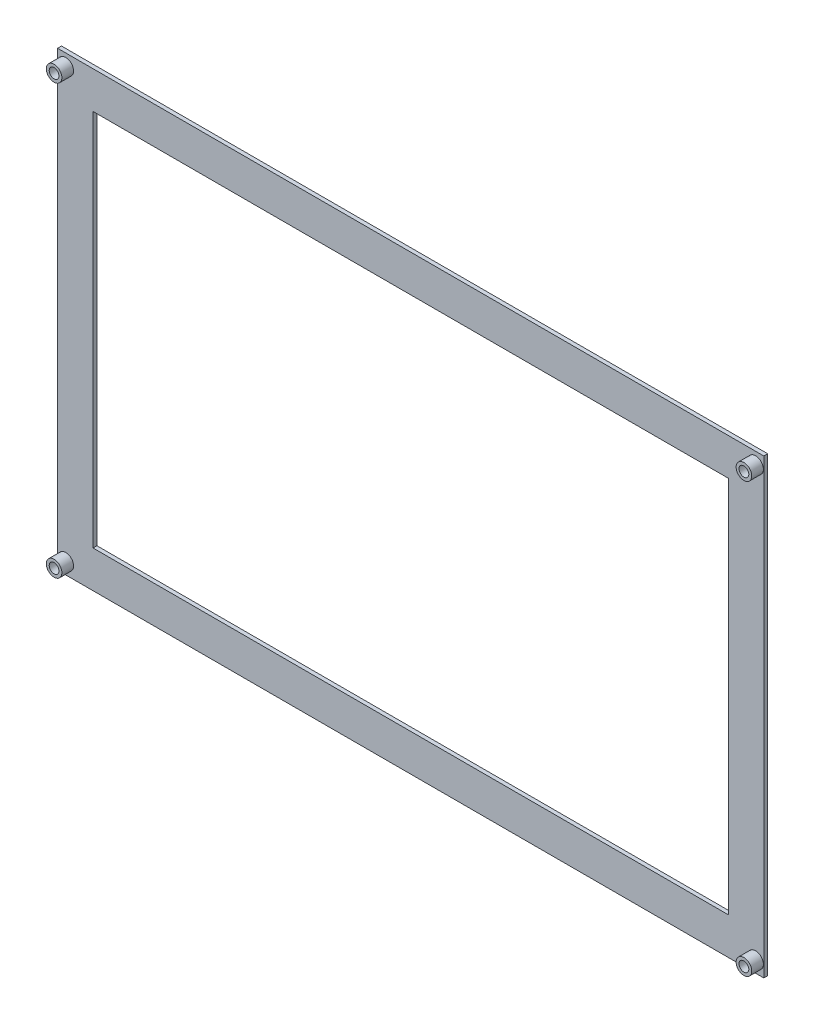
ISO-10303-21;
HEADER;
FILE_DESCRIPTION(('STEP AP214'),'2;1');
FILE_NAME('part.step','',(''),(''),'','','');
FILE_SCHEMA(('AUTOMOTIVE_DESIGN { 1 0 10303 214 1 1 1 1 }'));
ENDSEC;
DATA;
#1=APPLICATION_CONTEXT('core data for automotive mechanical design processes');
#2=APPLICATION_PROTOCOL_DEFINITION('international standard','automotive_design',2000,#1);
#3=PRODUCT_CONTEXT('',#1,'mechanical');
#4=PRODUCT('Part','Part','',(#3));
#5=PRODUCT_RELATED_PRODUCT_CATEGORY('part','',(#4));
#6=PRODUCT_DEFINITION_FORMATION('','',#4);
#7=PRODUCT_DEFINITION_CONTEXT('part definition',#1,'design');
#8=PRODUCT_DEFINITION('design','',#6,#7);
#9=PRODUCT_DEFINITION_SHAPE('','',#8);
#10=(LENGTH_UNIT() NAMED_UNIT(*) SI_UNIT(.MILLI.,.METRE.));
#11=(NAMED_UNIT(*) PLANE_ANGLE_UNIT() SI_UNIT($,.RADIAN.));
#12=(NAMED_UNIT(*) SI_UNIT($,.STERADIAN.) SOLID_ANGLE_UNIT());
#13=UNCERTAINTY_MEASURE_WITH_UNIT(LENGTH_MEASURE(1.E-05),#10,'distance_accuracy_value','');
#14=(GEOMETRIC_REPRESENTATION_CONTEXT(3) GLOBAL_UNCERTAINTY_ASSIGNED_CONTEXT((#13)) GLOBAL_UNIT_ASSIGNED_CONTEXT((#10,
#11,#12)) REPRESENTATION_CONTEXT('',''));
#15=CARTESIAN_POINT('',(0.,0.,0.));
#16=DIRECTION('',(0.,0.,1.));
#17=DIRECTION('',(1.,0.,0.));
#18=AXIS2_PLACEMENT_3D('',#15,#16,#17);
#19=CARTESIAN_POINT('',(90.6,58.,1.));
#20=DIRECTION('',(-1.,0.,0.));
#21=DIRECTION('',(0.,-1.,0.));
#22=AXIS2_PLACEMENT_3D('',#19,#20,#21);
#23=PLANE('',#22);
#24=DIRECTION('',(0.,1.,0.));
#25=VECTOR('',#24,1.);
#26=CARTESIAN_POINT('',(90.6,58.,0.));
#27=LINE('',#26,#25);
#28=CARTESIAN_POINT('',(90.6000000000001,-58.,0.));
#29=VERTEX_POINT('',#28);
#30=CARTESIAN_POINT('',(90.6,58.,0.));
#31=VERTEX_POINT('',#30);
#32=EDGE_CURVE('E169',#29,#31,#27,.T.);
#33=ORIENTED_EDGE('',*,*,#32,.T.);
#34=DIRECTION('',(0.,0.,-1.));
#35=VECTOR('',#34,1.);
#36=CARTESIAN_POINT('',(90.6,58.,1.));
#37=LINE('',#36,#35);
#38=CARTESIAN_POINT('',(90.6,58.,1.));
#39=VERTEX_POINT('',#38);
#40=EDGE_CURVE('E198',#39,#31,#37,.T.);
#41=ORIENTED_EDGE('',*,*,#40,.F.);
#42=DIRECTION('',(0.,1.,0.));
#43=VECTOR('',#42,1.);
#44=CARTESIAN_POINT('',(90.6,58.,1.));
#45=LINE('',#44,#43);
#46=CARTESIAN_POINT('',(90.6000000000001,-58.,1.));
#47=VERTEX_POINT('',#46);
#48=EDGE_CURVE('E172',#47,#39,#45,.T.);
#49=ORIENTED_EDGE('',*,*,#48,.F.);
#50=DIRECTION('',(0.,0.,-1.));
#51=VECTOR('',#50,1.);
#52=CARTESIAN_POINT('',(90.6000000000001,-58.,1.));
#53=LINE('',#52,#51);
#54=EDGE_CURVE('E182',#47,#29,#53,.T.);
#55=ORIENTED_EDGE('',*,*,#54,.T.);
#56=EDGE_LOOP('',(#33,#41,#49,#55));
#57=FACE_BOUND('',#56,.T.);
#58=ADVANCED_FACE('F36',(#57),#23,.F.);
#59=CARTESIAN_POINT('',(-90.6,58.,1.));
#60=DIRECTION('',(0.,-1.,0.));
#61=DIRECTION('',(0.,0.,-1.));
#62=AXIS2_PLACEMENT_3D('',#59,#60,#61);
#63=PLANE('',#62);
#64=DIRECTION('',(-1.,0.,0.));
#65=VECTOR('',#64,1.);
#66=CARTESIAN_POINT('',(-90.6,58.,0.));
#67=LINE('',#66,#65);
#68=CARTESIAN_POINT('',(-90.6,58.,0.));
#69=VERTEX_POINT('',#68);
#70=EDGE_CURVE('E185',#31,#69,#67,.T.);
#71=ORIENTED_EDGE('',*,*,#70,.T.);
#72=DIRECTION('',(0.,0.,-1.));
#73=VECTOR('',#72,1.);
#74=CARTESIAN_POINT('',(-90.6,58.,1.));
#75=LINE('',#74,#73);
#76=CARTESIAN_POINT('',(-90.6,58.,1.));
#77=VERTEX_POINT('',#76);
#78=EDGE_CURVE('E195',#77,#69,#75,.T.);
#79=ORIENTED_EDGE('',*,*,#78,.F.);
#80=DIRECTION('',(-1.,0.,0.));
#81=VECTOR('',#80,1.);
#82=CARTESIAN_POINT('',(-90.6,58.,1.));
#83=LINE('',#82,#81);
#84=EDGE_CURVE('E175',#39,#77,#83,.T.);
#85=ORIENTED_EDGE('',*,*,#84,.F.);
#86=ORIENTED_EDGE('',*,*,#40,.T.);
#87=EDGE_LOOP('',(#71,#79,#85,#86));
#88=FACE_BOUND('',#87,.T.);
#89=ADVANCED_FACE('F240',(#88),#63,.F.);
#90=CARTESIAN_POINT('',(-90.6,58.,1.));
#91=DIRECTION('',(1.,0.,0.));
#92=DIRECTION('',(0.,1.,0.));
#93=AXIS2_PLACEMENT_3D('',#90,#91,#92);
#94=PLANE('',#93);
#95=DIRECTION('',(0.,-1.,0.));
#96=VECTOR('',#95,1.);
#97=CARTESIAN_POINT('',(-90.6,58.,0.));
#98=LINE('',#97,#96);
#99=CARTESIAN_POINT('',(-90.6,-58.,0.));
#100=VERTEX_POINT('',#99);
#101=EDGE_CURVE('E187',#69,#100,#98,.T.);
#102=ORIENTED_EDGE('',*,*,#101,.T.);
#103=DIRECTION('',(0.,0.,-1.));
#104=VECTOR('',#103,1.);
#105=CARTESIAN_POINT('',(-90.6,-58.,1.));
#106=LINE('',#105,#104);
#107=CARTESIAN_POINT('',(-90.6,-58.,1.));
#108=VERTEX_POINT('',#107);
#109=EDGE_CURVE('E192',#108,#100,#106,.T.);
#110=ORIENTED_EDGE('',*,*,#109,.F.);
#111=DIRECTION('',(0.,-1.,0.));
#112=VECTOR('',#111,1.);
#113=CARTESIAN_POINT('',(-90.6,58.,1.));
#114=LINE('',#113,#112);
#115=EDGE_CURVE('E178',#77,#108,#114,.T.);
#116=ORIENTED_EDGE('',*,*,#115,.F.);
#117=ORIENTED_EDGE('',*,*,#78,.T.);
#118=EDGE_LOOP('',(#102,#110,#116,#117));
#119=FACE_BOUND('',#118,.T.);
#120=ADVANCED_FACE('F245',(#119),#94,.F.);
#121=CARTESIAN_POINT('',(-90.6,-58.,1.));
#122=DIRECTION('',(0.,1.,0.));
#123=DIRECTION('',(0.,0.,1.));
#124=AXIS2_PLACEMENT_3D('',#121,#122,#123);
#125=PLANE('',#124);
#126=DIRECTION('',(1.,0.,0.));
#127=VECTOR('',#126,1.);
#128=CARTESIAN_POINT('',(-90.6,-58.,0.));
#129=LINE('',#128,#127);
#130=EDGE_CURVE('E176',#100,#29,#129,.T.);
#131=ORIENTED_EDGE('',*,*,#130,.T.);
#132=ORIENTED_EDGE('',*,*,#54,.F.);
#133=DIRECTION('',(1.,0.,0.));
#134=VECTOR('',#133,1.);
#135=CARTESIAN_POINT('',(-90.6,-58.,1.));
#136=LINE('',#135,#134);
#137=EDGE_CURVE('E180',#108,#47,#136,.T.);
#138=ORIENTED_EDGE('',*,*,#137,.F.);
#139=ORIENTED_EDGE('',*,*,#109,.T.);
#140=EDGE_LOOP('',(#131,#132,#138,#139));
#141=FACE_BOUND('',#140,.T.);
#142=ADVANCED_FACE('F259',(#141),#125,.F.);
#143=CARTESIAN_POINT('',(0.,0.,1.));
#144=DIRECTION('',(0.,0.,1.));
#145=DIRECTION('',(1.,0.,0.));
#146=AXIS2_PLACEMENT_3D('',#143,#144,#145);
#147=PLANE('',#146);
#148=DIRECTION('',(0.,-1.,0.));
#149=VECTOR('',#148,1.);
#150=CARTESIAN_POINT('',(-81.5,0.,1.));
#151=LINE('',#150,#149);
#152=CARTESIAN_POINT('',(-81.5,48.5,1.));
#153=VERTEX_POINT('',#152);
#154=CARTESIAN_POINT('',(-81.5,-48.5,1.));
#155=VERTEX_POINT('',#154);
#156=EDGE_CURVE('E133',#153,#155,#151,.T.);
#157=ORIENTED_EDGE('',*,*,#156,.F.);
#158=DIRECTION('',(-1.,0.,0.));
#159=VECTOR('',#158,1.);
#160=CARTESIAN_POINT('',(0.,48.5,1.));
#161=LINE('',#160,#159);
#162=CARTESIAN_POINT('',(81.5,48.5,1.));
#163=VERTEX_POINT('',#162);
#164=EDGE_CURVE('E126',#163,#153,#161,.T.);
#165=ORIENTED_EDGE('',*,*,#164,.F.);
#166=DIRECTION('',(0.,1.,0.));
#167=VECTOR('',#166,1.);
#168=CARTESIAN_POINT('',(81.5,0.,1.));
#169=LINE('',#168,#167);
#170=CARTESIAN_POINT('',(81.5,-48.5,1.));
#171=VERTEX_POINT('',#170);
#172=EDGE_CURVE('E106',#171,#163,#169,.T.);
#173=ORIENTED_EDGE('',*,*,#172,.F.);
#174=DIRECTION('',(1.,0.,0.));
#175=VECTOR('',#174,1.);
#176=CARTESIAN_POINT('',(0.,-48.5,1.));
#177=LINE('',#176,#175);
#178=EDGE_CURVE('E131',#155,#171,#177,.T.);
#179=ORIENTED_EDGE('',*,*,#178,.F.);
#180=EDGE_LOOP('',(#157,#165,#173,#179));
#181=FACE_BOUND('',#180,.T.);
#182=CARTESIAN_POINT('',(-88.5,-55.,1.));
#183=DIRECTION('',(0.,0.,1.));
#184=DIRECTION('',(1.,0.,0.));
#185=AXIS2_PLACEMENT_3D('',#182,#183,#184);
#186=CIRCLE('',#185,1.99999999999998);
#187=CARTESIAN_POINT('',(-86.5,-55.,1.));
#188=VERTEX_POINT('',#187);
#189=EDGE_CURVE('E138',#188,#188,#186,.T.);
#190=ORIENTED_EDGE('',*,*,#189,.F.);
#191=EDGE_LOOP('',(#190));
#192=FACE_BOUND('',#191,.T.);
#193=CARTESIAN_POINT('',(88.5,-55.,1.));
#194=DIRECTION('',(0.,0.,1.));
#195=DIRECTION('',(1.,0.,0.));
#196=AXIS2_PLACEMENT_3D('',#193,#194,#195);
#197=CIRCLE('',#196,2.00000000000001);
#198=CARTESIAN_POINT('',(90.5,-55.,1.));
#199=VERTEX_POINT('',#198);
#200=EDGE_CURVE('E147',#199,#199,#197,.T.);
#201=ORIENTED_EDGE('',*,*,#200,.F.);
#202=EDGE_LOOP('',(#201));
#203=FACE_BOUND('',#202,.T.);
#204=CARTESIAN_POINT('',(88.5,55.,1.));
#205=DIRECTION('',(0.,0.,1.));
#206=DIRECTION('',(1.,0.,0.));
#207=AXIS2_PLACEMENT_3D('',#204,#205,#206);
#208=CIRCLE('',#207,2.00000000000001);
#209=CARTESIAN_POINT('',(90.5,55.,1.));
#210=VERTEX_POINT('',#209);
#211=EDGE_CURVE('E156',#210,#210,#208,.T.);
#212=ORIENTED_EDGE('',*,*,#211,.F.);
#213=EDGE_LOOP('',(#212));
#214=FACE_BOUND('',#213,.T.);
#215=CARTESIAN_POINT('',(-88.5,55.,1.));
#216=DIRECTION('',(0.,0.,1.));
#217=DIRECTION('',(1.,0.,0.));
#218=AXIS2_PLACEMENT_3D('',#215,#216,#217);
#219=CIRCLE('',#218,2.);
#220=CARTESIAN_POINT('',(-86.5,55.,1.));
#221=VERTEX_POINT('',#220);
#222=EDGE_CURVE('E165',#221,#221,#219,.T.);
#223=ORIENTED_EDGE('',*,*,#222,.F.);
#224=EDGE_LOOP('',(#223));
#225=FACE_BOUND('',#224,.T.);
#226=ORIENTED_EDGE('',*,*,#48,.T.);
#227=ORIENTED_EDGE('',*,*,#84,.T.);
#228=ORIENTED_EDGE('',*,*,#115,.T.);
#229=ORIENTED_EDGE('',*,*,#137,.T.);
#230=EDGE_LOOP('',(#226,#227,#228,#229));
#231=FACE_BOUND('',#230,.T.);
#232=ADVANCED_FACE('F227',(#181,#192,#203,#214,#225,#231),#147,.T.);
#233=CARTESIAN_POINT('',(0.,0.,0.));
#234=DIRECTION('',(0.,0.,1.));
#235=DIRECTION('',(1.,0.,0.));
#236=AXIS2_PLACEMENT_3D('',#233,#234,#235);
#237=PLANE('',#236);
#238=DIRECTION('',(1.,0.,0.));
#239=VECTOR('',#238,1.);
#240=CARTESIAN_POINT('',(81.5,48.5,0.));
#241=LINE('',#240,#239);
#242=CARTESIAN_POINT('',(-81.5,48.5,0.));
#243=VERTEX_POINT('',#242);
#244=CARTESIAN_POINT('',(81.5,48.5,0.));
#245=VERTEX_POINT('',#244);
#246=EDGE_CURVE('E112',#243,#245,#241,.T.);
#247=ORIENTED_EDGE('',*,*,#246,.F.);
#248=DIRECTION('',(0.,1.,0.));
#249=VECTOR('',#248,1.);
#250=CARTESIAN_POINT('',(-81.5,48.5,0.));
#251=LINE('',#250,#249);
#252=CARTESIAN_POINT('',(-81.5,-48.5,0.));
#253=VERTEX_POINT('',#252);
#254=EDGE_CURVE('E58',#253,#243,#251,.T.);
#255=ORIENTED_EDGE('',*,*,#254,.F.);
#256=DIRECTION('',(-1.,0.,0.));
#257=VECTOR('',#256,1.);
#258=CARTESIAN_POINT('',(81.5,-48.5,0.));
#259=LINE('',#258,#257);
#260=CARTESIAN_POINT('',(81.5,-48.5,0.));
#261=VERTEX_POINT('',#260);
#262=EDGE_CURVE('E119',#261,#253,#259,.T.);
#263=ORIENTED_EDGE('',*,*,#262,.F.);
#264=DIRECTION('',(0.,-1.,0.));
#265=VECTOR('',#264,1.);
#266=CARTESIAN_POINT('',(81.5,48.5,0.));
#267=LINE('',#266,#265);
#268=EDGE_CURVE('E103',#245,#261,#267,.T.);
#269=ORIENTED_EDGE('',*,*,#268,.F.);
#270=EDGE_LOOP('',(#247,#255,#263,#269));
#271=FACE_BOUND('',#270,.T.);
#272=ORIENTED_EDGE('',*,*,#32,.F.);
#273=ORIENTED_EDGE('',*,*,#130,.F.);
#274=ORIENTED_EDGE('',*,*,#101,.F.);
#275=ORIENTED_EDGE('',*,*,#70,.F.);
#276=EDGE_LOOP('',(#272,#273,#274,#275));
#277=FACE_BOUND('',#276,.T.);
#278=ADVANCED_FACE('F116',(#271,#277),#237,.F.);
#279=CARTESIAN_POINT('',(-88.5,55.,4.));
#280=DIRECTION('',(0.,0.,1.));
#281=DIRECTION('',(1.,0.,0.));
#282=AXIS2_PLACEMENT_3D('',#279,#280,#281);
#283=PLANE('',#282);
#284=CARTESIAN_POINT('',(-88.5,55.,4.));
#285=DIRECTION('',(0.,0.,1.));
#286=DIRECTION('',(1.,0.,0.));
#287=AXIS2_PLACEMENT_3D('',#284,#285,#286);
#288=CIRCLE('',#287,2.);
#289=CARTESIAN_POINT('',(-86.5,55.,4.));
#290=VERTEX_POINT('',#289);
#291=EDGE_CURVE('E166',#290,#290,#288,.T.);
#292=ORIENTED_EDGE('',*,*,#291,.T.);
#293=EDGE_LOOP('',(#292));
#294=FACE_BOUND('',#293,.T.);
#295=CARTESIAN_POINT('',(-88.5,55.,4.));
#296=DIRECTION('',(0.,0.,1.));
#297=DIRECTION('',(1.,0.,0.));
#298=AXIS2_PLACEMENT_3D('',#295,#296,#297);
#299=CIRCLE('',#298,1.25);
#300=CARTESIAN_POINT('',(-87.25,55.,4.));
#301=VERTEX_POINT('',#300);
#302=EDGE_CURVE('E160',#301,#301,#299,.T.);
#303=ORIENTED_EDGE('',*,*,#302,.F.);
#304=EDGE_LOOP('',(#303));
#305=FACE_BOUND('',#304,.T.);
#306=ADVANCED_FACE('F268',(#294,#305),#283,.T.);
#307=CARTESIAN_POINT('',(-88.5,55.,4.));
#308=DIRECTION('',(0.,0.,-1.));
#309=DIRECTION('',(-1.,0.,0.));
#310=AXIS2_PLACEMENT_3D('',#307,#308,#309);
#311=CYLINDRICAL_SURFACE('',#310,2.);
#312=ORIENTED_EDGE('',*,*,#291,.F.);
#313=EDGE_LOOP('',(#312));
#314=FACE_BOUND('',#313,.T.);
#315=ORIENTED_EDGE('',*,*,#222,.T.);
#316=EDGE_LOOP('',(#315));
#317=FACE_BOUND('',#316,.T.);
#318=ADVANCED_FACE('F273',(#314,#317),#311,.T.);
#319=CARTESIAN_POINT('',(-88.5,55.,4.));
#320=DIRECTION('',(0.,0.,-1.));
#321=DIRECTION('',(-1.,0.,0.));
#322=AXIS2_PLACEMENT_3D('',#319,#320,#321);
#323=CYLINDRICAL_SURFACE('',#322,1.25);
#324=ORIENTED_EDGE('',*,*,#302,.T.);
#325=EDGE_LOOP('',(#324));
#326=FACE_BOUND('',#325,.T.);
#327=CARTESIAN_POINT('',(-88.5,55.,1.));
#328=DIRECTION('',(0.,0.,1.));
#329=DIRECTION('',(1.,0.,0.));
#330=AXIS2_PLACEMENT_3D('',#327,#328,#329);
#331=CIRCLE('',#330,1.25);
#332=CARTESIAN_POINT('',(-87.25,55.,1.));
#333=VERTEX_POINT('',#332);
#334=EDGE_CURVE('E201',#333,#333,#331,.F.);
#335=ORIENTED_EDGE('',*,*,#334,.T.);
#336=EDGE_LOOP('',(#335));
#337=FACE_BOUND('',#336,.T.);
#338=ADVANCED_FACE('F283',(#326,#337),#323,.F.);
#339=ORIENTED_EDGE('',*,*,#334,.F.);
#340=EDGE_LOOP('',(#339));
#341=FACE_BOUND('',#340,.T.);
#342=ADVANCED_FACE('F234',(#341),#147,.T.);
#343=CARTESIAN_POINT('',(88.5,55.,4.));
#344=DIRECTION('',(0.,0.,1.));
#345=DIRECTION('',(1.,0.,0.));
#346=AXIS2_PLACEMENT_3D('',#343,#344,#345);
#347=PLANE('',#346);
#348=CARTESIAN_POINT('',(88.5,55.,4.));
#349=DIRECTION('',(0.,0.,1.));
#350=DIRECTION('',(1.,0.,0.));
#351=AXIS2_PLACEMENT_3D('',#348,#349,#350);
#352=CIRCLE('',#351,2.00000000000001);
#353=CARTESIAN_POINT('',(90.5,55.,4.));
#354=VERTEX_POINT('',#353);
#355=EDGE_CURVE('E157',#354,#354,#352,.T.);
#356=ORIENTED_EDGE('',*,*,#355,.T.);
#357=EDGE_LOOP('',(#356));
#358=FACE_BOUND('',#357,.T.);
#359=CARTESIAN_POINT('',(88.5,55.,4.));
#360=DIRECTION('',(0.,0.,1.));
#361=DIRECTION('',(1.,0.,0.));
#362=AXIS2_PLACEMENT_3D('',#359,#360,#361);
#363=CIRCLE('',#362,1.25);
#364=CARTESIAN_POINT('',(89.75,55.,4.));
#365=VERTEX_POINT('',#364);
#366=EDGE_CURVE('E151',#365,#365,#363,.T.);
#367=ORIENTED_EDGE('',*,*,#366,.F.);
#368=EDGE_LOOP('',(#367));
#369=FACE_BOUND('',#368,.T.);
#370=ADVANCED_FACE('F282',(#358,#369),#347,.T.);
#371=CARTESIAN_POINT('',(88.5,55.,4.));
#372=DIRECTION('',(0.,0.,-1.));
#373=DIRECTION('',(-1.,0.,0.));
#374=AXIS2_PLACEMENT_3D('',#371,#372,#373);
#375=CYLINDRICAL_SURFACE('',#374,2.00000000000001);
#376=ORIENTED_EDGE('',*,*,#355,.F.);
#377=EDGE_LOOP('',(#376));
#378=FACE_BOUND('',#377,.T.);
#379=ORIENTED_EDGE('',*,*,#211,.T.);
#380=EDGE_LOOP('',(#379));
#381=FACE_BOUND('',#380,.T.);
#382=ADVANCED_FACE('F289',(#378,#381),#375,.T.);
#383=CARTESIAN_POINT('',(88.5,55.,4.));
#384=DIRECTION('',(0.,0.,-1.));
#385=DIRECTION('',(-1.,0.,0.));
#386=AXIS2_PLACEMENT_3D('',#383,#384,#385);
#387=CYLINDRICAL_SURFACE('',#386,1.25);
#388=ORIENTED_EDGE('',*,*,#366,.T.);
#389=EDGE_LOOP('',(#388));
#390=FACE_BOUND('',#389,.T.);
#391=CARTESIAN_POINT('',(88.5,55.,1.));
#392=DIRECTION('',(0.,0.,1.));
#393=DIRECTION('',(1.,0.,0.));
#394=AXIS2_PLACEMENT_3D('',#391,#392,#393);
#395=CIRCLE('',#394,1.25);
#396=CARTESIAN_POINT('',(89.75,55.,1.));
#397=VERTEX_POINT('',#396);
#398=EDGE_CURVE('E204',#397,#397,#395,.F.);
#399=ORIENTED_EDGE('',*,*,#398,.T.);
#400=EDGE_LOOP('',(#399));
#401=FACE_BOUND('',#400,.T.);
#402=ADVANCED_FACE('F232',(#390,#401),#387,.F.);
#403=ORIENTED_EDGE('',*,*,#398,.F.);
#404=EDGE_LOOP('',(#403));
#405=FACE_BOUND('',#404,.T.);
#406=ADVANCED_FACE('F215',(#405),#147,.T.);
#407=CARTESIAN_POINT('',(88.5,-55.,4.));
#408=DIRECTION('',(0.,0.,1.));
#409=DIRECTION('',(1.,0.,0.));
#410=AXIS2_PLACEMENT_3D('',#407,#408,#409);
#411=PLANE('',#410);
#412=CARTESIAN_POINT('',(88.5,-55.,4.));
#413=DIRECTION('',(0.,0.,1.));
#414=DIRECTION('',(1.,0.,0.));
#415=AXIS2_PLACEMENT_3D('',#412,#413,#414);
#416=CIRCLE('',#415,2.00000000000001);
#417=CARTESIAN_POINT('',(90.5,-55.,4.));
#418=VERTEX_POINT('',#417);
#419=EDGE_CURVE('E148',#418,#418,#416,.T.);
#420=ORIENTED_EDGE('',*,*,#419,.T.);
#421=EDGE_LOOP('',(#420));
#422=FACE_BOUND('',#421,.T.);
#423=CARTESIAN_POINT('',(88.5,-55.,4.));
#424=DIRECTION('',(0.,0.,1.));
#425=DIRECTION('',(1.,0.,0.));
#426=AXIS2_PLACEMENT_3D('',#423,#424,#425);
#427=CIRCLE('',#426,1.25);
#428=CARTESIAN_POINT('',(89.75,-55.,4.));
#429=VERTEX_POINT('',#428);
#430=EDGE_CURVE('E142',#429,#429,#427,.T.);
#431=ORIENTED_EDGE('',*,*,#430,.F.);
#432=EDGE_LOOP('',(#431));
#433=FACE_BOUND('',#432,.T.);
#434=ADVANCED_FACE('F231',(#422,#433),#411,.T.);
#435=CARTESIAN_POINT('',(88.5,-55.,4.));
#436=DIRECTION('',(0.,0.,-1.));
#437=DIRECTION('',(-1.,0.,0.));
#438=AXIS2_PLACEMENT_3D('',#435,#436,#437);
#439=CYLINDRICAL_SURFACE('',#438,2.00000000000001);
#440=ORIENTED_EDGE('',*,*,#419,.F.);
#441=EDGE_LOOP('',(#440));
#442=FACE_BOUND('',#441,.T.);
#443=ORIENTED_EDGE('',*,*,#200,.T.);
#444=EDGE_LOOP('',(#443));
#445=FACE_BOUND('',#444,.T.);
#446=ADVANCED_FACE('F224',(#442,#445),#439,.T.);
#447=CARTESIAN_POINT('',(88.5,-55.,4.));
#448=DIRECTION('',(0.,0.,-1.));
#449=DIRECTION('',(-1.,0.,0.));
#450=AXIS2_PLACEMENT_3D('',#447,#448,#449);
#451=CYLINDRICAL_SURFACE('',#450,1.25);
#452=ORIENTED_EDGE('',*,*,#430,.T.);
#453=EDGE_LOOP('',(#452));
#454=FACE_BOUND('',#453,.T.);
#455=CARTESIAN_POINT('',(88.5,-55.,1.));
#456=DIRECTION('',(0.,0.,1.));
#457=DIRECTION('',(1.,0.,0.));
#458=AXIS2_PLACEMENT_3D('',#455,#456,#457);
#459=CIRCLE('',#458,1.25);
#460=CARTESIAN_POINT('',(89.75,-55.,1.));
#461=VERTEX_POINT('',#460);
#462=EDGE_CURVE('E43',#461,#461,#459,.F.);
#463=ORIENTED_EDGE('',*,*,#462,.T.);
#464=EDGE_LOOP('',(#463));
#465=FACE_BOUND('',#464,.T.);
#466=ADVANCED_FACE('F209',(#454,#465),#451,.F.);
#467=ORIENTED_EDGE('',*,*,#462,.F.);
#468=EDGE_LOOP('',(#467));
#469=FACE_BOUND('',#468,.T.);
#470=ADVANCED_FACE('F211',(#469),#147,.T.);
#471=CARTESIAN_POINT('',(-88.5,-55.,4.));
#472=DIRECTION('',(0.,0.,1.));
#473=DIRECTION('',(1.,0.,0.));
#474=AXIS2_PLACEMENT_3D('',#471,#472,#473);
#475=PLANE('',#474);
#476=CARTESIAN_POINT('',(-88.5,-55.,4.));
#477=DIRECTION('',(0.,0.,1.));
#478=DIRECTION('',(1.,0.,0.));
#479=AXIS2_PLACEMENT_3D('',#476,#477,#478);
#480=CIRCLE('',#479,1.99999999999998);
#481=CARTESIAN_POINT('',(-86.5,-55.,4.));
#482=VERTEX_POINT('',#481);
#483=EDGE_CURVE('E139',#482,#482,#480,.T.);
#484=ORIENTED_EDGE('',*,*,#483,.T.);
#485=EDGE_LOOP('',(#484));
#486=FACE_BOUND('',#485,.T.);
#487=CARTESIAN_POINT('',(-88.5,-55.,4.));
#488=DIRECTION('',(0.,0.,1.));
#489=DIRECTION('',(1.,0.,0.));
#490=AXIS2_PLACEMENT_3D('',#487,#488,#489);
#491=CIRCLE('',#490,1.25);
#492=CARTESIAN_POINT('',(-87.25,-55.,4.));
#493=VERTEX_POINT('',#492);
#494=EDGE_CURVE('E135',#493,#493,#491,.T.);
#495=ORIENTED_EDGE('',*,*,#494,.F.);
#496=EDGE_LOOP('',(#495));
#497=FACE_BOUND('',#496,.T.);
#498=ADVANCED_FACE('F213',(#486,#497),#475,.T.);
#499=CARTESIAN_POINT('',(-88.5,-55.,4.));
#500=DIRECTION('',(0.,0.,-1.));
#501=DIRECTION('',(-1.,0.,0.));
#502=AXIS2_PLACEMENT_3D('',#499,#500,#501);
#503=CYLINDRICAL_SURFACE('',#502,1.99999999999998);
#504=ORIENTED_EDGE('',*,*,#483,.F.);
#505=EDGE_LOOP('',(#504));
#506=FACE_BOUND('',#505,.T.);
#507=ORIENTED_EDGE('',*,*,#189,.T.);
#508=EDGE_LOOP('',(#507));
#509=FACE_BOUND('',#508,.T.);
#510=ADVANCED_FACE('F221',(#506,#509),#503,.T.);
#511=CARTESIAN_POINT('',(-88.5,-55.,4.));
#512=DIRECTION('',(0.,0.,-1.));
#513=DIRECTION('',(-1.,0.,0.));
#514=AXIS2_PLACEMENT_3D('',#511,#512,#513);
#515=CYLINDRICAL_SURFACE('',#514,1.25);
#516=ORIENTED_EDGE('',*,*,#494,.T.);
#517=EDGE_LOOP('',(#516));
#518=FACE_BOUND('',#517,.T.);
#519=CARTESIAN_POINT('',(-88.5,-55.,1.));
#520=DIRECTION('',(0.,0.,1.));
#521=DIRECTION('',(1.,0.,0.));
#522=AXIS2_PLACEMENT_3D('',#519,#520,#521);
#523=CIRCLE('',#522,1.25);
#524=CARTESIAN_POINT('',(-87.25,-55.,1.));
#525=VERTEX_POINT('',#524);
#526=EDGE_CURVE('E11',#525,#525,#523,.F.);
#527=ORIENTED_EDGE('',*,*,#526,.T.);
#528=EDGE_LOOP('',(#527));
#529=FACE_BOUND('',#528,.T.);
#530=ADVANCED_FACE('F237',(#518,#529),#515,.F.);
#531=ORIENTED_EDGE('',*,*,#526,.F.);
#532=EDGE_LOOP('',(#531));
#533=FACE_BOUND('',#532,.T.);
#534=ADVANCED_FACE('F216',(#533),#147,.T.);
#535=CARTESIAN_POINT('',(-81.5,48.5,3.));
#536=DIRECTION('',(-1.,0.,0.));
#537=DIRECTION('',(0.,0.,1.));
#538=AXIS2_PLACEMENT_3D('',#535,#536,#537);
#539=PLANE('',#538);
#540=ORIENTED_EDGE('',*,*,#156,.T.);
#541=DIRECTION('',(0.,0.,-1.));
#542=VECTOR('',#541,1.);
#543=CARTESIAN_POINT('',(-81.5,-48.5,3.));
#544=LINE('',#543,#542);
#545=EDGE_CURVE('E124',#155,#253,#544,.T.);
#546=ORIENTED_EDGE('',*,*,#545,.T.);
#547=ORIENTED_EDGE('',*,*,#254,.T.);
#548=DIRECTION('',(0.,0.,-1.));
#549=VECTOR('',#548,1.);
#550=CARTESIAN_POINT('',(-81.5,48.5,3.));
#551=LINE('',#550,#549);
#552=EDGE_CURVE('E109',#153,#243,#551,.T.);
#553=ORIENTED_EDGE('',*,*,#552,.F.);
#554=EDGE_LOOP('',(#540,#546,#547,#553));
#555=FACE_BOUND('',#554,.T.);
#556=ADVANCED_FACE('F236',(#555),#539,.F.);
#557=CARTESIAN_POINT('',(81.5,-48.5,3.));
#558=DIRECTION('',(0.,-1.,0.));
#559=DIRECTION('',(0.,0.,-1.));
#560=AXIS2_PLACEMENT_3D('',#557,#558,#559);
#561=PLANE('',#560);
#562=ORIENTED_EDGE('',*,*,#178,.T.);
#563=DIRECTION('',(0.,0.,-1.));
#564=VECTOR('',#563,1.);
#565=CARTESIAN_POINT('',(81.5,-48.5,3.));
#566=LINE('',#565,#564);
#567=EDGE_CURVE('E108',#171,#261,#566,.T.);
#568=ORIENTED_EDGE('',*,*,#567,.T.);
#569=ORIENTED_EDGE('',*,*,#262,.T.);
#570=ORIENTED_EDGE('',*,*,#545,.F.);
#571=EDGE_LOOP('',(#562,#568,#569,#570));
#572=FACE_BOUND('',#571,.T.);
#573=ADVANCED_FACE('F321',(#572),#561,.F.);
#574=CARTESIAN_POINT('',(81.5,48.5,3.));
#575=DIRECTION('',(1.,0.,0.));
#576=DIRECTION('',(0.,1.,0.));
#577=AXIS2_PLACEMENT_3D('',#574,#575,#576);
#578=PLANE('',#577);
#579=ORIENTED_EDGE('',*,*,#172,.T.);
#580=DIRECTION('',(0.,0.,-1.));
#581=VECTOR('',#580,1.);
#582=CARTESIAN_POINT('',(81.5,48.5,3.));
#583=LINE('',#582,#581);
#584=EDGE_CURVE('E50',#163,#245,#583,.T.);
#585=ORIENTED_EDGE('',*,*,#584,.T.);
#586=ORIENTED_EDGE('',*,*,#268,.T.);
#587=ORIENTED_EDGE('',*,*,#567,.F.);
#588=EDGE_LOOP('',(#579,#585,#586,#587));
#589=FACE_BOUND('',#588,.T.);
#590=ADVANCED_FACE('F100',(#589),#578,.F.);
#591=CARTESIAN_POINT('',(81.5,48.5,3.));
#592=DIRECTION('',(0.,1.,0.));
#593=DIRECTION('',(0.,0.,1.));
#594=AXIS2_PLACEMENT_3D('',#591,#592,#593);
#595=PLANE('',#594);
#596=ORIENTED_EDGE('',*,*,#164,.T.);
#597=ORIENTED_EDGE('',*,*,#552,.T.);
#598=ORIENTED_EDGE('',*,*,#246,.T.);
#599=ORIENTED_EDGE('',*,*,#584,.F.);
#600=EDGE_LOOP('',(#596,#597,#598,#599));
#601=FACE_BOUND('',#600,.T.);
#602=ADVANCED_FACE('F113',(#601),#595,.F.);
#603=CLOSED_SHELL('',(#58,#89,#120,#142,#232,#278,#306,#318,#338,#342,#370,#382,#402,#406,#434,
#446,#466,#470,#498,#510,#530,#534,#556,#573,#590,#602));
#604=MANIFOLD_SOLID_BREP('B2',#603);
#605=ADVANCED_BREP_SHAPE_REPRESENTATION('',(#18,#604),#14);
#606=SHAPE_DEFINITION_REPRESENTATION(#9,#605);
ENDSEC;
END-ISO-10303-21;
